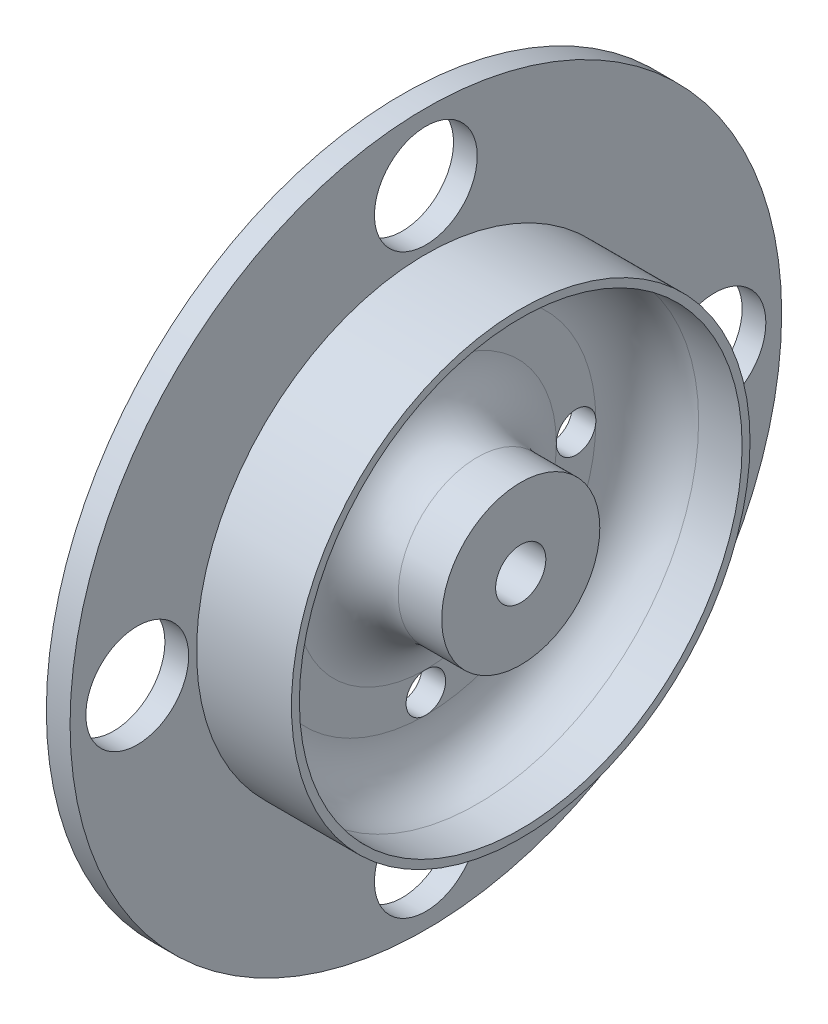
ISO-10303-21;
HEADER;
FILE_DESCRIPTION(('STEP AP214'),'2;1');
FILE_NAME('part.step','',(''),(''),'','','');
FILE_SCHEMA(('AUTOMOTIVE_DESIGN { 1 0 10303 214 1 1 1 1 }'));
ENDSEC;
DATA;
#1=APPLICATION_CONTEXT('core data for automotive mechanical design processes');
#2=APPLICATION_PROTOCOL_DEFINITION('international standard','automotive_design',2000,#1);
#3=PRODUCT_CONTEXT('',#1,'mechanical');
#4=PRODUCT('Part','Part','',(#3));
#5=PRODUCT_RELATED_PRODUCT_CATEGORY('part','',(#4));
#6=PRODUCT_DEFINITION_FORMATION('','',#4);
#7=PRODUCT_DEFINITION_CONTEXT('part definition',#1,'design');
#8=PRODUCT_DEFINITION('design','',#6,#7);
#9=PRODUCT_DEFINITION_SHAPE('','',#8);
#10=(LENGTH_UNIT() NAMED_UNIT(*) SI_UNIT(.MILLI.,.METRE.));
#11=(NAMED_UNIT(*) PLANE_ANGLE_UNIT() SI_UNIT($,.RADIAN.));
#12=(NAMED_UNIT(*) SI_UNIT($,.STERADIAN.) SOLID_ANGLE_UNIT());
#13=UNCERTAINTY_MEASURE_WITH_UNIT(LENGTH_MEASURE(1.E-05),#10,'distance_accuracy_value','');
#14=(GEOMETRIC_REPRESENTATION_CONTEXT(3) GLOBAL_UNCERTAINTY_ASSIGNED_CONTEXT((#13)) GLOBAL_UNIT_ASSIGNED_CONTEXT((#10,
#11,#12)) REPRESENTATION_CONTEXT('',''));
#15=CARTESIAN_POINT('',(0.,0.,0.));
#16=DIRECTION('',(0.,0.,1.));
#17=DIRECTION('',(1.,0.,0.));
#18=AXIS2_PLACEMENT_3D('',#15,#16,#17);
#19=CARTESIAN_POINT('',(3.0475130098464,0.,0.));
#20=DIRECTION('',(1.,0.,0.));
#21=DIRECTION('',(0.,0.,-1.));
#22=AXIS2_PLACEMENT_3D('',#19,#20,#21);
#23=PLANE('',#22);
#24=CARTESIAN_POINT('',(3.0475130098464,0.,16.8888888888889));
#25=DIRECTION('',(1.,0.,0.));
#26=DIRECTION('',(0.,0.,-1.));
#27=AXIS2_PLACEMENT_3D('',#24,#25,#26);
#28=CIRCLE('',#27,2.22222222222222);
#29=CARTESIAN_POINT('',(3.0475130098464,0.,14.6666666666667));
#30=VERTEX_POINT('',#29);
#31=CARTESIAN_POINT('',(3.0475130098464,0.,19.1111111111111));
#32=VERTEX_POINT('',#31);
#33=EDGE_CURVE('E51',#30,#32,#28,.T.);
#34=ORIENTED_EDGE('',*,*,#33,.F.);
#35=CARTESIAN_POINT('',(3.0475130098464,0.,0.));
#36=DIRECTION('',(1.,0.,0.));
#37=DIRECTION('',(0.,0.,-1.));
#38=AXIS2_PLACEMENT_3D('',#35,#36,#37);
#39=CIRCLE('',#38,14.6666666666667);
#40=CARTESIAN_POINT('',(3.0475130098464,14.6666666666667,0.));
#41=VERTEX_POINT('',#40);
#42=EDGE_CURVE('E84',#30,#41,#39,.F.);
#43=ORIENTED_EDGE('',*,*,#42,.T.);
#44=CARTESIAN_POINT('',(3.0475130098464,16.8888888888889,0.));
#45=DIRECTION('',(1.,0.,0.));
#46=DIRECTION('',(0.,0.,-1.));
#47=AXIS2_PLACEMENT_3D('',#44,#45,#46);
#48=CIRCLE('',#47,2.22222222222222);
#49=CARTESIAN_POINT('',(3.0475130098464,19.1111111111111,0.));
#50=VERTEX_POINT('',#49);
#51=EDGE_CURVE('E156',#50,#41,#48,.T.);
#52=ORIENTED_EDGE('',*,*,#51,.F.);
#53=CARTESIAN_POINT('',(3.0475130098464,0.,0.));
#54=DIRECTION('',(1.,0.,0.));
#55=DIRECTION('',(0.,0.,-1.));
#56=AXIS2_PLACEMENT_3D('',#53,#54,#55);
#57=CIRCLE('',#56,19.1111111111111);
#58=EDGE_CURVE('E87',#50,#32,#57,.T.);
#59=ORIENTED_EDGE('',*,*,#58,.T.);
#60=EDGE_LOOP('',(#34,#43,#52,#59));
#61=FACE_BOUND('',#60,.T.);
#62=ADVANCED_FACE('F37',(#61),#23,.T.);
#63=EDGE_CURVE('E76',#32,#30,#28,.T.);
#64=ORIENTED_EDGE('',*,*,#63,.F.);
#65=CARTESIAN_POINT('',(3.0475130098464,-19.1111111111111,0.));
#66=VERTEX_POINT('',#65);
#67=EDGE_CURVE('E58',#32,#66,#57,.T.);
#68=ORIENTED_EDGE('',*,*,#67,.T.);
#69=CARTESIAN_POINT('',(3.0475130098464,-16.8888888888889,0.));
#70=DIRECTION('',(1.,0.,0.));
#71=DIRECTION('',(0.,0.,-1.));
#72=AXIS2_PLACEMENT_3D('',#69,#70,#71);
#73=CIRCLE('',#72,2.22222222222222);
#74=CARTESIAN_POINT('',(3.0475130098464,-14.6666666666667,0.));
#75=VERTEX_POINT('',#74);
#76=EDGE_CURVE('E99',#75,#66,#73,.T.);
#77=ORIENTED_EDGE('',*,*,#76,.F.);
#78=EDGE_CURVE('E95',#75,#30,#39,.F.);
#79=ORIENTED_EDGE('',*,*,#78,.T.);
#80=EDGE_LOOP('',(#64,#68,#77,#79));
#81=FACE_BOUND('',#80,.T.);
#82=ADVANCED_FACE('F98',(#81),#23,.T.);
#83=CARTESIAN_POINT('',(3.0475130098464,0.,-16.8888888888889));
#84=DIRECTION('',(1.,0.,0.));
#85=DIRECTION('',(0.,0.,-1.));
#86=AXIS2_PLACEMENT_3D('',#83,#84,#85);
#87=CIRCLE('',#86,2.22222222222222);
#88=CARTESIAN_POINT('',(3.0475130098464,0.,-19.1111111111111));
#89=VERTEX_POINT('',#88);
#90=CARTESIAN_POINT('',(3.0475130098464,0.,-14.6666666666667));
#91=VERTEX_POINT('',#90);
#92=EDGE_CURVE('E161',#89,#91,#87,.T.);
#93=ORIENTED_EDGE('',*,*,#92,.F.);
#94=EDGE_CURVE('E103',#89,#50,#57,.T.);
#95=ORIENTED_EDGE('',*,*,#94,.T.);
#96=EDGE_CURVE('E158',#41,#50,#48,.T.);
#97=ORIENTED_EDGE('',*,*,#96,.F.);
#98=EDGE_CURVE('E45',#41,#91,#39,.F.);
#99=ORIENTED_EDGE('',*,*,#98,.T.);
#100=EDGE_LOOP('',(#93,#95,#97,#99));
#101=FACE_BOUND('',#100,.T.);
#102=ADVANCED_FACE('F191',(#101),#23,.T.);
#103=CARTESIAN_POINT('',(3.0475130098464,0.,0.));
#104=DIRECTION('',(-1.,0.,0.));
#105=DIRECTION('',(0.,0.,1.));
#106=AXIS2_PLACEMENT_3D('',#103,#104,#105);
#107=CYLINDRICAL_SURFACE('',#106,40.);
#108=CARTESIAN_POINT('',(3.0475130098464,0.,0.));
#109=DIRECTION('',(1.,0.,0.));
#110=DIRECTION('',(0.,0.,-1.));
#111=AXIS2_PLACEMENT_3D('',#108,#109,#110);
#112=CIRCLE('',#111,40.);
#113=CARTESIAN_POINT('',(3.0475130098464,0.,-40.));
#114=VERTEX_POINT('',#113);
#115=EDGE_CURVE('E107',#114,#114,#112,.T.);
#116=ORIENTED_EDGE('',*,*,#115,.F.);
#117=EDGE_LOOP('',(#116));
#118=FACE_BOUND('',#117,.T.);
#119=CARTESIAN_POINT('',(0.380846343179729,0.,0.));
#120=DIRECTION('',(1.,0.,0.));
#121=DIRECTION('',(0.,0.,-1.));
#122=AXIS2_PLACEMENT_3D('',#119,#120,#121);
#123=CIRCLE('',#122,40.);
#124=CARTESIAN_POINT('',(0.380846343179729,0.,-40.));
#125=VERTEX_POINT('',#124);
#126=EDGE_CURVE('E108',#125,#125,#123,.T.);
#127=ORIENTED_EDGE('',*,*,#126,.T.);
#128=EDGE_LOOP('',(#127));
#129=FACE_BOUND('',#128,.T.);
#130=ADVANCED_FACE('F219',(#118,#129),#107,.T.);
#131=CARTESIAN_POINT('',(3.0475130098464,0.,32.4444444444444));
#132=DIRECTION('',(1.,0.,0.));
#133=DIRECTION('',(0.,0.,-1.));
#134=AXIS2_PLACEMENT_3D('',#131,#132,#133);
#135=CIRCLE('',#134,5.77777777777778);
#136=CARTESIAN_POINT('',(3.0475130098464,0.,26.6666666666667));
#137=VERTEX_POINT('',#136);
#138=EDGE_CURVE('E150',#137,#137,#135,.T.);
#139=ORIENTED_EDGE('',*,*,#138,.F.);
#140=EDGE_LOOP('',(#139));
#141=FACE_BOUND('',#140,.T.);
#142=CARTESIAN_POINT('',(3.0475130098464,-32.4444444444444,0.));
#143=DIRECTION('',(1.,0.,0.));
#144=DIRECTION('',(0.,0.,-1.));
#145=AXIS2_PLACEMENT_3D('',#142,#143,#144);
#146=CIRCLE('',#145,5.77777777777778);
#147=CARTESIAN_POINT('',(3.0475130098464,-32.4444444444444,-5.77777777777779));
#148=VERTEX_POINT('',#147);
#149=EDGE_CURVE('E144',#148,#148,#146,.T.);
#150=ORIENTED_EDGE('',*,*,#149,.F.);
#151=EDGE_LOOP('',(#150));
#152=FACE_BOUND('',#151,.T.);
#153=CARTESIAN_POINT('',(3.0475130098464,0.,-32.4444444444444));
#154=DIRECTION('',(1.,0.,0.));
#155=DIRECTION('',(0.,0.,-1.));
#156=AXIS2_PLACEMENT_3D('',#153,#154,#155);
#157=CIRCLE('',#156,5.77777777777778);
#158=CARTESIAN_POINT('',(3.0475130098464,0.,-38.2222222222222));
#159=VERTEX_POINT('',#158);
#160=EDGE_CURVE('E138',#159,#159,#157,.T.);
#161=ORIENTED_EDGE('',*,*,#160,.F.);
#162=EDGE_LOOP('',(#161));
#163=FACE_BOUND('',#162,.T.);
#164=CARTESIAN_POINT('',(3.0475130098464,32.4444444444444,0.));
#165=DIRECTION('',(1.,0.,0.));
#166=DIRECTION('',(0.,0.,-1.));
#167=AXIS2_PLACEMENT_3D('',#164,#165,#166);
#168=CIRCLE('',#167,5.77777777777778);
#169=CARTESIAN_POINT('',(3.0475130098464,32.4444444444444,-5.77777777777778));
#170=VERTEX_POINT('',#169);
#171=EDGE_CURVE('E132',#170,#170,#168,.T.);
#172=ORIENTED_EDGE('',*,*,#171,.F.);
#173=EDGE_LOOP('',(#172));
#174=FACE_BOUND('',#173,.T.);
#175=CARTESIAN_POINT('',(3.0475130098464,0.,0.));
#176=DIRECTION('',(1.,0.,0.));
#177=DIRECTION('',(0.,0.,-1.));
#178=AXIS2_PLACEMENT_3D('',#175,#176,#177);
#179=CIRCLE('',#178,25.7777777777778);
#180=CARTESIAN_POINT('',(3.0475130098464,0.,-25.7777777777778));
#181=VERTEX_POINT('',#180);
#182=EDGE_CURVE('E117',#181,#181,#179,.T.);
#183=ORIENTED_EDGE('',*,*,#182,.F.);
#184=EDGE_LOOP('',(#183));
#185=FACE_BOUND('',#184,.T.);
#186=ORIENTED_EDGE('',*,*,#115,.T.);
#187=EDGE_LOOP('',(#186));
#188=FACE_BOUND('',#187,.T.);
#189=ADVANCED_FACE('F211',(#141,#152,#163,#174,#185,#188),#23,.T.);
#190=CARTESIAN_POINT('',(0.380846343179729,0.,0.));
#191=DIRECTION('',(1.,0.,0.));
#192=DIRECTION('',(0.,0.,-1.));
#193=AXIS2_PLACEMENT_3D('',#190,#191,#192);
#194=PLANE('',#193);
#195=CARTESIAN_POINT('',(0.380846343179729,0.,16.8888888888889));
#196=DIRECTION('',(1.,0.,0.));
#197=DIRECTION('',(0.,0.,-1.));
#198=AXIS2_PLACEMENT_3D('',#195,#196,#197);
#199=CIRCLE('',#198,2.22222222222222);
#200=CARTESIAN_POINT('',(0.380846343179729,0.,14.6666666666667));
#201=VERTEX_POINT('',#200);
#202=EDGE_CURVE('E88',#201,#201,#199,.T.);
#203=ORIENTED_EDGE('',*,*,#202,.T.);
#204=EDGE_LOOP('',(#203));
#205=FACE_BOUND('',#204,.T.);
#206=CARTESIAN_POINT('',(0.380846343179729,-16.8888888888889,0.));
#207=DIRECTION('',(1.,0.,0.));
#208=DIRECTION('',(0.,0.,-1.));
#209=AXIS2_PLACEMENT_3D('',#206,#207,#208);
#210=CIRCLE('',#209,2.22222222222222);
#211=CARTESIAN_POINT('',(0.380846343179729,-16.8888888888889,-2.22222222222223));
#212=VERTEX_POINT('',#211);
#213=EDGE_CURVE('E168',#212,#212,#210,.T.);
#214=ORIENTED_EDGE('',*,*,#213,.T.);
#215=EDGE_LOOP('',(#214));
#216=FACE_BOUND('',#215,.T.);
#217=CARTESIAN_POINT('',(0.380846343179729,0.,-16.8888888888889));
#218=DIRECTION('',(1.,0.,0.));
#219=DIRECTION('',(0.,0.,-1.));
#220=AXIS2_PLACEMENT_3D('',#217,#218,#219);
#221=CIRCLE('',#220,2.22222222222222);
#222=CARTESIAN_POINT('',(0.380846343179729,0.,-19.1111111111111));
#223=VERTEX_POINT('',#222);
#224=EDGE_CURVE('E163',#223,#223,#221,.T.);
#225=ORIENTED_EDGE('',*,*,#224,.T.);
#226=EDGE_LOOP('',(#225));
#227=FACE_BOUND('',#226,.T.);
#228=CARTESIAN_POINT('',(0.380846343179729,16.8888888888889,0.));
#229=DIRECTION('',(1.,0.,0.));
#230=DIRECTION('',(0.,0.,-1.));
#231=AXIS2_PLACEMENT_3D('',#228,#229,#230);
#232=CIRCLE('',#231,2.22222222222222);
#233=CARTESIAN_POINT('',(0.380846343179729,16.8888888888889,-2.22222222222222));
#234=VERTEX_POINT('',#233);
#235=EDGE_CURVE('E153',#234,#234,#232,.T.);
#236=ORIENTED_EDGE('',*,*,#235,.T.);
#237=EDGE_LOOP('',(#236));
#238=FACE_BOUND('',#237,.T.);
#239=CARTESIAN_POINT('',(0.380846343179729,0.,32.4444444444444));
#240=DIRECTION('',(1.,0.,0.));
#241=DIRECTION('',(0.,0.,-1.));
#242=AXIS2_PLACEMENT_3D('',#239,#240,#241);
#243=CIRCLE('',#242,5.77777777777778);
#244=CARTESIAN_POINT('',(0.380846343179729,0.,26.6666666666667));
#245=VERTEX_POINT('',#244);
#246=EDGE_CURVE('E147',#245,#245,#243,.T.);
#247=ORIENTED_EDGE('',*,*,#246,.T.);
#248=EDGE_LOOP('',(#247));
#249=FACE_BOUND('',#248,.T.);
#250=CARTESIAN_POINT('',(0.380846343179729,-32.4444444444444,0.));
#251=DIRECTION('',(1.,0.,0.));
#252=DIRECTION('',(0.,0.,-1.));
#253=AXIS2_PLACEMENT_3D('',#250,#251,#252);
#254=CIRCLE('',#253,5.77777777777778);
#255=CARTESIAN_POINT('',(0.380846343179729,-32.4444444444444,-5.77777777777779));
#256=VERTEX_POINT('',#255);
#257=EDGE_CURVE('E141',#256,#256,#254,.T.);
#258=ORIENTED_EDGE('',*,*,#257,.T.);
#259=EDGE_LOOP('',(#258));
#260=FACE_BOUND('',#259,.T.);
#261=CARTESIAN_POINT('',(0.380846343179729,0.,-32.4444444444444));
#262=DIRECTION('',(1.,0.,0.));
#263=DIRECTION('',(0.,0.,-1.));
#264=AXIS2_PLACEMENT_3D('',#261,#262,#263);
#265=CIRCLE('',#264,5.77777777777778);
#266=CARTESIAN_POINT('',(0.380846343179729,0.,-38.2222222222222));
#267=VERTEX_POINT('',#266);
#268=EDGE_CURVE('E135',#267,#267,#265,.T.);
#269=ORIENTED_EDGE('',*,*,#268,.T.);
#270=EDGE_LOOP('',(#269));
#271=FACE_BOUND('',#270,.T.);
#272=CARTESIAN_POINT('',(0.380846343179729,32.4444444444444,0.));
#273=DIRECTION('',(1.,0.,0.));
#274=DIRECTION('',(0.,0.,-1.));
#275=AXIS2_PLACEMENT_3D('',#272,#273,#274);
#276=CIRCLE('',#275,5.77777777777778);
#277=CARTESIAN_POINT('',(0.380846343179729,32.4444444444444,-5.77777777777778));
#278=VERTEX_POINT('',#277);
#279=EDGE_CURVE('E131',#278,#278,#276,.T.);
#280=ORIENTED_EDGE('',*,*,#279,.T.);
#281=EDGE_LOOP('',(#280));
#282=FACE_BOUND('',#281,.T.);
#283=CARTESIAN_POINT('',(0.380846343179729,0.,0.));
#284=DIRECTION('',(1.,0.,0.));
#285=DIRECTION('',(0.,0.,-1.));
#286=AXIS2_PLACEMENT_3D('',#283,#284,#285);
#287=CIRCLE('',#286,2.82222222222222);
#288=CARTESIAN_POINT('',(0.38084634317973,0.,-2.82222222222222));
#289=VERTEX_POINT('',#288);
#290=EDGE_CURVE('E125',#289,#289,#287,.F.);
#291=ORIENTED_EDGE('',*,*,#290,.F.);
#292=EDGE_LOOP('',(#291));
#293=FACE_BOUND('',#292,.T.);
#294=ORIENTED_EDGE('',*,*,#126,.F.);
#295=EDGE_LOOP('',(#294));
#296=FACE_BOUND('',#295,.T.);
#297=ADVANCED_FACE('F218',(#205,#216,#227,#238,#249,#260,#271,#282,#293,#296),#194,.F.);
#298=CARTESIAN_POINT('',(13.7141796765131,0.,0.));
#299=DIRECTION('',(1.,0.,0.));
#300=DIRECTION('',(0.,0.,-1.));
#301=AXIS2_PLACEMENT_3D('',#298,#299,#300);
#302=PLANE('',#301);
#303=CARTESIAN_POINT('',(13.7141796765131,0.,0.));
#304=DIRECTION('',(1.,0.,0.));
#305=DIRECTION('',(0.,0.,-1.));
#306=AXIS2_PLACEMENT_3D('',#303,#304,#305);
#307=CIRCLE('',#306,25.7777777777778);
#308=CARTESIAN_POINT('',(13.7141796765131,0.,-25.7777777777778));
#309=VERTEX_POINT('',#308);
#310=EDGE_CURVE('E116',#309,#309,#307,.T.);
#311=ORIENTED_EDGE('',*,*,#310,.T.);
#312=EDGE_LOOP('',(#311));
#313=FACE_BOUND('',#312,.T.);
#314=CARTESIAN_POINT('',(13.7141796765131,0.,0.));
#315=DIRECTION('',(1.,0.,0.));
#316=DIRECTION('',(0.,0.,-1.));
#317=AXIS2_PLACEMENT_3D('',#314,#315,#316);
#318=CIRCLE('',#317,24.8888888888889);
#319=CARTESIAN_POINT('',(13.7141796765131,0.,-24.8888888888889));
#320=VERTEX_POINT('',#319);
#321=EDGE_CURVE('E120',#320,#320,#318,.T.);
#322=ORIENTED_EDGE('',*,*,#321,.F.);
#323=EDGE_LOOP('',(#322));
#324=FACE_BOUND('',#323,.T.);
#325=ADVANCED_FACE('F225',(#313,#324),#302,.T.);
#326=CARTESIAN_POINT('',(13.7141796765131,0.,0.));
#327=DIRECTION('',(-1.,0.,0.));
#328=DIRECTION('',(0.,0.,1.));
#329=AXIS2_PLACEMENT_3D('',#326,#327,#328);
#330=CYLINDRICAL_SURFACE('',#329,25.7777777777778);
#331=ORIENTED_EDGE('',*,*,#310,.F.);
#332=EDGE_LOOP('',(#331));
#333=FACE_BOUND('',#332,.T.);
#334=ORIENTED_EDGE('',*,*,#182,.T.);
#335=EDGE_LOOP('',(#334));
#336=FACE_BOUND('',#335,.T.);
#337=ADVANCED_FACE('F270',(#333,#336),#330,.T.);
#338=CARTESIAN_POINT('',(13.7141796765131,0.,0.));
#339=DIRECTION('',(-1.,0.,0.));
#340=DIRECTION('',(0.,0.,1.));
#341=AXIS2_PLACEMENT_3D('',#338,#339,#340);
#342=CYLINDRICAL_SURFACE('',#341,24.8888888888889);
#343=CARTESIAN_POINT('',(8.82529078762417,0.,0.));
#344=DIRECTION('',(1.,0.,0.));
#345=DIRECTION('',(0.,0.,-1.));
#346=AXIS2_PLACEMENT_3D('',#343,#344,#345);
#347=CIRCLE('',#346,24.8888888888889);
#348=CARTESIAN_POINT('',(8.82529078762417,0.,-24.8888888888889));
#349=VERTEX_POINT('',#348);
#350=EDGE_CURVE('E11',#349,#349,#347,.F.);
#351=ORIENTED_EDGE('',*,*,#350,.T.);
#352=EDGE_LOOP('',(#351));
#353=FACE_BOUND('',#352,.T.);
#354=ORIENTED_EDGE('',*,*,#321,.T.);
#355=EDGE_LOOP('',(#354));
#356=FACE_BOUND('',#355,.T.);
#357=ADVANCED_FACE('F281',(#353,#356),#342,.F.);
#358=CARTESIAN_POINT('',(13.7141796765131,0.,0.));
#359=DIRECTION('',(1.,0.,0.));
#360=DIRECTION('',(0.,0.,-1.));
#361=AXIS2_PLACEMENT_3D('',#358,#359,#360);
#362=PLANE('',#361);
#363=CARTESIAN_POINT('',(13.7141796765131,0.,0.));
#364=DIRECTION('',(1.,0.,0.));
#365=DIRECTION('',(0.,0.,-1.));
#366=AXIS2_PLACEMENT_3D('',#363,#364,#365);
#367=CIRCLE('',#366,2.82222222222222);
#368=CARTESIAN_POINT('',(13.7141796765131,0.,-2.82222222222222));
#369=VERTEX_POINT('',#368);
#370=EDGE_CURVE('E128',#369,#369,#367,.T.);
#371=ORIENTED_EDGE('',*,*,#370,.F.);
#372=EDGE_LOOP('',(#371));
#373=FACE_BOUND('',#372,.T.);
#374=CARTESIAN_POINT('',(13.7141796765131,0.,0.));
#375=DIRECTION('',(1.,0.,0.));
#376=DIRECTION('',(0.,0.,-1.));
#377=AXIS2_PLACEMENT_3D('',#374,#375,#376);
#378=CIRCLE('',#377,8.88888888888889);
#379=CARTESIAN_POINT('',(13.7141796765131,0.,-8.88888888888889));
#380=VERTEX_POINT('',#379);
#381=EDGE_CURVE('E111',#380,#380,#378,.T.);
#382=ORIENTED_EDGE('',*,*,#381,.T.);
#383=EDGE_LOOP('',(#382));
#384=FACE_BOUND('',#383,.T.);
#385=ADVANCED_FACE('F239',(#373,#384),#362,.T.);
#386=CARTESIAN_POINT('',(13.7141796765131,0.,0.));
#387=DIRECTION('',(-1.,0.,0.));
#388=DIRECTION('',(0.,0.,1.));
#389=AXIS2_PLACEMENT_3D('',#386,#387,#388);
#390=CYLINDRICAL_SURFACE('',#389,8.88888888888889);
#391=CARTESIAN_POINT('',(8.82529078762417,0.,0.));
#392=DIRECTION('',(1.,0.,0.));
#393=DIRECTION('',(0.,0.,-1.));
#394=AXIS2_PLACEMENT_3D('',#391,#392,#393);
#395=CIRCLE('',#394,8.88888888888889);
#396=CARTESIAN_POINT('',(8.82529078762417,0.,-8.88888888888889));
#397=VERTEX_POINT('',#396);
#398=EDGE_CURVE('E104',#397,#397,#395,.T.);
#399=ORIENTED_EDGE('',*,*,#398,.T.);
#400=EDGE_LOOP('',(#399));
#401=FACE_BOUND('',#400,.T.);
#402=ORIENTED_EDGE('',*,*,#381,.F.);
#403=EDGE_LOOP('',(#402));
#404=FACE_BOUND('',#403,.T.);
#405=ADVANCED_FACE('F232',(#401,#404),#390,.T.);
#406=EDGE_CURVE('E169',#66,#75,#73,.T.);
#407=ORIENTED_EDGE('',*,*,#406,.F.);
#408=EDGE_CURVE('E182',#66,#89,#57,.T.);
#409=ORIENTED_EDGE('',*,*,#408,.T.);
#410=EDGE_CURVE('E164',#91,#89,#87,.T.);
#411=ORIENTED_EDGE('',*,*,#410,.F.);
#412=EDGE_CURVE('E100',#91,#75,#39,.F.);
#413=ORIENTED_EDGE('',*,*,#412,.T.);
#414=EDGE_LOOP('',(#407,#409,#411,#413));
#415=FACE_BOUND('',#414,.T.);
#416=ADVANCED_FACE('F180',(#415),#23,.T.);
#417=CARTESIAN_POINT('',(-7.60160354221507,0.,0.));
#418=DIRECTION('',(1.,0.,0.));
#419=DIRECTION('',(0.,0.,-1.));
#420=AXIS2_PLACEMENT_3D('',#417,#418,#419);
#421=CYLINDRICAL_SURFACE('',#420,2.82222222222222);
#422=CARTESIAN_POINT('',(0.38084634317973,0.,-2.82222222222222));
#423=CARTESIAN_POINT('',(0.519735232068619,0.,-2.82222222222222));
#424=CARTESIAN_POINT('',(0.658624120957507,0.,-2.82222222222222));
#425=CARTESIAN_POINT('',(0.936401898735285,0.,-2.82222222222222));
#426=CARTESIAN_POINT('',(1.07529078762417,0.,-2.82222222222222));
#427=CARTESIAN_POINT('',(1.35306856540195,0.,-2.82222222222222));
#428=CARTESIAN_POINT('',(1.49195745429084,0.,-2.82222222222222));
#429=CARTESIAN_POINT('',(1.76973523206862,0.,-2.82222222222222));
#430=CARTESIAN_POINT('',(1.90862412095751,0.,-2.82222222222222));
#431=CARTESIAN_POINT('',(2.18640189873529,0.,-2.82222222222222));
#432=CARTESIAN_POINT('',(2.32529078762417,0.,-2.82222222222222));
#433=CARTESIAN_POINT('',(2.60306856540195,0.,-2.82222222222222));
#434=CARTESIAN_POINT('',(2.74195745429084,0.,-2.82222222222222));
#435=CARTESIAN_POINT('',(3.01973523206862,0.,-2.82222222222222));
#436=CARTESIAN_POINT('',(3.15862412095751,0.,-2.82222222222222));
#437=CARTESIAN_POINT('',(3.43640189873529,0.,-2.82222222222222));
#438=CARTESIAN_POINT('',(3.57529078762417,0.,-2.82222222222222));
#439=CARTESIAN_POINT('',(3.85306856540195,0.,-2.82222222222222));
#440=CARTESIAN_POINT('',(3.99195745429084,0.,-2.82222222222222));
#441=CARTESIAN_POINT('',(4.26973523206862,0.,-2.82222222222222));
#442=CARTESIAN_POINT('',(4.40862412095751,0.,-2.82222222222222));
#443=CARTESIAN_POINT('',(4.68640189873528,0.,-2.82222222222222));
#444=CARTESIAN_POINT('',(4.82529078762417,0.,-2.82222222222222));
#445=CARTESIAN_POINT('',(5.10306856540195,0.,-2.82222222222222));
#446=CARTESIAN_POINT('',(5.24195745429084,0.,-2.82222222222222));
#447=CARTESIAN_POINT('',(5.51973523206862,0.,-2.82222222222222));
#448=CARTESIAN_POINT('',(5.65862412095751,0.,-2.82222222222222));
#449=CARTESIAN_POINT('',(5.93640189873529,0.,-2.82222222222222));
#450=CARTESIAN_POINT('',(6.07529078762417,0.,-2.82222222222222));
#451=CARTESIAN_POINT('',(6.35306856540195,0.,-2.82222222222222));
#452=CARTESIAN_POINT('',(6.49195745429084,0.,-2.82222222222222));
#453=CARTESIAN_POINT('',(6.76973523206862,0.,-2.82222222222222));
#454=CARTESIAN_POINT('',(6.90862412095751,0.,-2.82222222222222));
#455=CARTESIAN_POINT('',(7.18640189873529,0.,-2.82222222222222));
#456=CARTESIAN_POINT('',(7.32529078762417,0.,-2.82222222222222));
#457=CARTESIAN_POINT('',(7.60306856540195,0.,-2.82222222222222));
#458=CARTESIAN_POINT('',(7.74195745429084,0.,-2.82222222222222));
#459=CARTESIAN_POINT('',(8.01973523206862,0.,-2.82222222222222));
#460=CARTESIAN_POINT('',(8.15862412095751,0.,-2.82222222222222));
#461=CARTESIAN_POINT('',(8.43640189873528,0.,-2.82222222222222));
#462=CARTESIAN_POINT('',(8.57529078762417,0.,-2.82222222222222));
#463=CARTESIAN_POINT('',(8.85306856540195,0.,-2.82222222222222));
#464=CARTESIAN_POINT('',(8.99195745429084,0.,-2.82222222222222));
#465=CARTESIAN_POINT('',(9.26973523206862,0.,-2.82222222222222));
#466=CARTESIAN_POINT('',(9.4086241209575,0.,-2.82222222222222));
#467=CARTESIAN_POINT('',(9.68640189873528,0.,-2.82222222222222));
#468=CARTESIAN_POINT('',(9.82529078762417,0.,-2.82222222222222));
#469=CARTESIAN_POINT('',(10.1030685654019,0.,-2.82222222222222));
#470=CARTESIAN_POINT('',(10.2419574542908,0.,-2.82222222222222));
#471=CARTESIAN_POINT('',(10.5197352320686,0.,-2.82222222222222));
#472=CARTESIAN_POINT('',(10.6586241209575,0.,-2.82222222222222));
#473=CARTESIAN_POINT('',(10.9364018987353,0.,-2.82222222222222));
#474=CARTESIAN_POINT('',(11.0752907876242,0.,-2.82222222222222));
#475=CARTESIAN_POINT('',(11.3530685654019,0.,-2.82222222222222));
#476=CARTESIAN_POINT('',(11.4919574542908,0.,-2.82222222222222));
#477=CARTESIAN_POINT('',(11.7697352320686,0.,-2.82222222222222));
#478=CARTESIAN_POINT('',(11.9086241209575,0.,-2.82222222222222));
#479=CARTESIAN_POINT('',(12.1864018987353,0.,-2.82222222222222));
#480=CARTESIAN_POINT('',(12.3252907876242,0.,-2.82222222222222));
#481=CARTESIAN_POINT('',(12.6030685654019,0.,-2.82222222222222));
#482=CARTESIAN_POINT('',(12.7419574542908,0.,-2.82222222222222));
#483=CARTESIAN_POINT('',(13.0197352320686,0.,-2.82222222222222));
#484=CARTESIAN_POINT('',(13.1586241209575,0.,-2.82222222222222));
#485=CARTESIAN_POINT('',(13.4364018987353,0.,-2.82222222222222));
#486=CARTESIAN_POINT('',(13.5752907876242,0.,-2.82222222222222));
#487=CARTESIAN_POINT('',(13.7141796765131,0.,-2.82222222222222));
#488=B_SPLINE_CURVE_WITH_KNOTS('',3,(#422,#423,#424,#425,#426,#427,#428,#429,#430,#431,#432,
#433,#434,#435,#436,#437,#438,#439,#440,#441,#442,#443,#444,#445,#446,#447,#448,#449,#450,#451,
#452,#453,#454,#455,#456,#457,#458,#459,#460,#461,#462,#463,#464,#465,#466,#467,#468,#469,#470,
#471,#472,#473,#474,#475,#476,#477,#478,#479,#480,#481,#482,#483,#484,#485,#486,#487),
.UNSPECIFIED.,.F.,.F.,(4,2,2,2,2,2,2,2,2,2,2,2,2,2,2,2,2,2,2,2,2,2,2,2,2,2,2,2,2,2,2,2,4),(0.,
0.416666666666666,0.833333333333333,1.25,1.66666666666667,2.08333333333333,2.5,2.91666666666667,
3.33333333333333,3.75,4.16666666666667,4.58333333333333,5.,5.41666666666667,5.83333333333333,
6.25,6.66666666666667,7.08333333333333,7.5,7.91666666666666,8.33333333333333,8.75,
9.16666666666666,9.58333333333333,10.,10.4166666666667,10.8333333333333,11.25,11.6666666666667,
12.0833333333333,12.5,12.9166666666667,13.3333333333333),.UNSPECIFIED.);
#489=EDGE_CURVE('BSEAM231',#289,#369,#488,.T.);
#490=ORIENTED_EDGE('',*,*,#290,.T.);
#491=ORIENTED_EDGE('',*,*,#370,.T.);
#492=ORIENTED_EDGE('',*,*,#489,.T.);
#493=ORIENTED_EDGE('',*,*,#489,.F.);
#494=EDGE_LOOP('',(#490,#492,#491,#493));
#495=FACE_BOUND('',#494,.T.);
#496=ADVANCED_FACE('F231',(#495),#421,.F.);
#497=CARTESIAN_POINT('',(8.82529078762417,0.,0.));
#498=DIRECTION('',(1.,0.,0.));
#499=DIRECTION('',(0.,0.,-1.));
#500=AXIS2_PLACEMENT_3D('',#497,#498,#499);
#501=TOROIDAL_SURFACE('',#500,14.6666666666667,5.77777777777778);
#502=ORIENTED_EDGE('',*,*,#98,.F.);
#503=ORIENTED_EDGE('',*,*,#42,.F.);
#504=ORIENTED_EDGE('',*,*,#78,.F.);
#505=ORIENTED_EDGE('',*,*,#412,.F.);
#506=EDGE_LOOP('',(#502,#503,#504,#505));
#507=FACE_BOUND('',#506,.T.);
#508=ORIENTED_EDGE('',*,*,#398,.F.);
#509=EDGE_LOOP('',(#508));
#510=FACE_BOUND('',#509,.T.);
#511=ADVANCED_FACE('F92',(#507,#510),#501,.F.);
#512=CARTESIAN_POINT('',(8.82529078762417,0.,0.));
#513=DIRECTION('',(1.,0.,0.));
#514=DIRECTION('',(0.,0.,-1.));
#515=AXIS2_PLACEMENT_3D('',#512,#513,#514);
#516=TOROIDAL_SURFACE('',#515,19.1111111111111,5.77777777777778);
#517=ORIENTED_EDGE('',*,*,#58,.F.);
#518=ORIENTED_EDGE('',*,*,#94,.F.);
#519=ORIENTED_EDGE('',*,*,#408,.F.);
#520=ORIENTED_EDGE('',*,*,#67,.F.);
#521=EDGE_LOOP('',(#517,#518,#519,#520));
#522=FACE_BOUND('',#521,.T.);
#523=ORIENTED_EDGE('',*,*,#350,.F.);
#524=EDGE_LOOP('',(#523));
#525=FACE_BOUND('',#524,.T.);
#526=ADVANCED_FACE('F39',(#522,#525),#516,.F.);
#527=CARTESIAN_POINT('',(0.380846343179729,32.4444444444444,0.));
#528=DIRECTION('',(1.,0.,0.));
#529=DIRECTION('',(0.,0.,-1.));
#530=AXIS2_PLACEMENT_3D('',#527,#528,#529);
#531=CYLINDRICAL_SURFACE('',#530,5.77777777777778);
#532=ORIENTED_EDGE('',*,*,#279,.F.);
#533=EDGE_LOOP('',(#532));
#534=FACE_BOUND('',#533,.T.);
#535=ORIENTED_EDGE('',*,*,#171,.T.);
#536=EDGE_LOOP('',(#535));
#537=FACE_BOUND('',#536,.T.);
#538=ADVANCED_FACE('F330',(#534,#537),#531,.F.);
#539=CARTESIAN_POINT('',(0.380846343179729,0.,-32.4444444444444));
#540=DIRECTION('',(1.,0.,0.));
#541=DIRECTION('',(0.,0.,-1.));
#542=AXIS2_PLACEMENT_3D('',#539,#540,#541);
#543=CYLINDRICAL_SURFACE('',#542,5.77777777777778);
#544=ORIENTED_EDGE('',*,*,#268,.F.);
#545=EDGE_LOOP('',(#544));
#546=FACE_BOUND('',#545,.T.);
#547=ORIENTED_EDGE('',*,*,#160,.T.);
#548=EDGE_LOOP('',(#547));
#549=FACE_BOUND('',#548,.T.);
#550=ADVANCED_FACE('F338',(#546,#549),#543,.F.);
#551=CARTESIAN_POINT('',(0.380846343179729,-32.4444444444444,0.));
#552=DIRECTION('',(1.,0.,0.));
#553=DIRECTION('',(0.,0.,-1.));
#554=AXIS2_PLACEMENT_3D('',#551,#552,#553);
#555=CYLINDRICAL_SURFACE('',#554,5.77777777777778);
#556=ORIENTED_EDGE('',*,*,#257,.F.);
#557=EDGE_LOOP('',(#556));
#558=FACE_BOUND('',#557,.T.);
#559=ORIENTED_EDGE('',*,*,#149,.T.);
#560=EDGE_LOOP('',(#559));
#561=FACE_BOUND('',#560,.T.);
#562=ADVANCED_FACE('F205',(#558,#561),#555,.F.);
#563=CARTESIAN_POINT('',(0.380846343179729,0.,32.4444444444444));
#564=DIRECTION('',(1.,0.,0.));
#565=DIRECTION('',(0.,0.,-1.));
#566=AXIS2_PLACEMENT_3D('',#563,#564,#565);
#567=CYLINDRICAL_SURFACE('',#566,5.77777777777778);
#568=ORIENTED_EDGE('',*,*,#246,.F.);
#569=EDGE_LOOP('',(#568));
#570=FACE_BOUND('',#569,.T.);
#571=ORIENTED_EDGE('',*,*,#138,.T.);
#572=EDGE_LOOP('',(#571));
#573=FACE_BOUND('',#572,.T.);
#574=ADVANCED_FACE('F196',(#570,#573),#567,.F.);
#575=CARTESIAN_POINT('',(0.380846343179729,16.8888888888889,0.));
#576=DIRECTION('',(1.,0.,0.));
#577=DIRECTION('',(0.,0.,-1.));
#578=AXIS2_PLACEMENT_3D('',#575,#576,#577);
#579=CYLINDRICAL_SURFACE('',#578,2.22222222222222);
#580=ORIENTED_EDGE('',*,*,#235,.F.);
#581=EDGE_LOOP('',(#580));
#582=FACE_BOUND('',#581,.T.);
#583=ORIENTED_EDGE('',*,*,#51,.T.);
#584=ORIENTED_EDGE('',*,*,#96,.T.);
#585=EDGE_LOOP('',(#583,#584));
#586=FACE_BOUND('',#585,.T.);
#587=ADVANCED_FACE('F193',(#582,#586),#579,.F.);
#588=CARTESIAN_POINT('',(0.380846343179729,0.,-16.8888888888889));
#589=DIRECTION('',(1.,0.,0.));
#590=DIRECTION('',(0.,0.,-1.));
#591=AXIS2_PLACEMENT_3D('',#588,#589,#590);
#592=CYLINDRICAL_SURFACE('',#591,2.22222222222222);
#593=ORIENTED_EDGE('',*,*,#224,.F.);
#594=EDGE_LOOP('',(#593));
#595=FACE_BOUND('',#594,.T.);
#596=ORIENTED_EDGE('',*,*,#92,.T.);
#597=ORIENTED_EDGE('',*,*,#410,.T.);
#598=EDGE_LOOP('',(#596,#597));
#599=FACE_BOUND('',#598,.T.);
#600=ADVANCED_FACE('F195',(#595,#599),#592,.F.);
#601=CARTESIAN_POINT('',(0.380846343179729,-16.8888888888889,0.));
#602=DIRECTION('',(1.,0.,0.));
#603=DIRECTION('',(0.,0.,-1.));
#604=AXIS2_PLACEMENT_3D('',#601,#602,#603);
#605=CYLINDRICAL_SURFACE('',#604,2.22222222222222);
#606=ORIENTED_EDGE('',*,*,#213,.F.);
#607=EDGE_LOOP('',(#606));
#608=FACE_BOUND('',#607,.T.);
#609=ORIENTED_EDGE('',*,*,#76,.T.);
#610=ORIENTED_EDGE('',*,*,#406,.T.);
#611=EDGE_LOOP('',(#609,#610));
#612=FACE_BOUND('',#611,.T.);
#613=ADVANCED_FACE('F177',(#608,#612),#605,.F.);
#614=CARTESIAN_POINT('',(0.380846343179729,0.,16.8888888888889));
#615=DIRECTION('',(1.,0.,0.));
#616=DIRECTION('',(0.,0.,-1.));
#617=AXIS2_PLACEMENT_3D('',#614,#615,#616);
#618=CYLINDRICAL_SURFACE('',#617,2.22222222222222);
#619=ORIENTED_EDGE('',*,*,#202,.F.);
#620=EDGE_LOOP('',(#619));
#621=FACE_BOUND('',#620,.T.);
#622=ORIENTED_EDGE('',*,*,#33,.T.);
#623=ORIENTED_EDGE('',*,*,#63,.T.);
#624=EDGE_LOOP('',(#622,#623));
#625=FACE_BOUND('',#624,.T.);
#626=ADVANCED_FACE('F77',(#621,#625),#618,.F.);
#627=CLOSED_SHELL('',(#62,#82,#102,#130,#189,#297,#325,#337,#357,#385,#405,#416,#496,#511,#526,
#538,#550,#562,#574,#587,#600,#613,#626));
#628=MANIFOLD_SOLID_BREP('B2',#627);
#629=ADVANCED_BREP_SHAPE_REPRESENTATION('',(#18,#628),#14);
#630=SHAPE_DEFINITION_REPRESENTATION(#9,#629);
ENDSEC;
END-ISO-10303-21;
